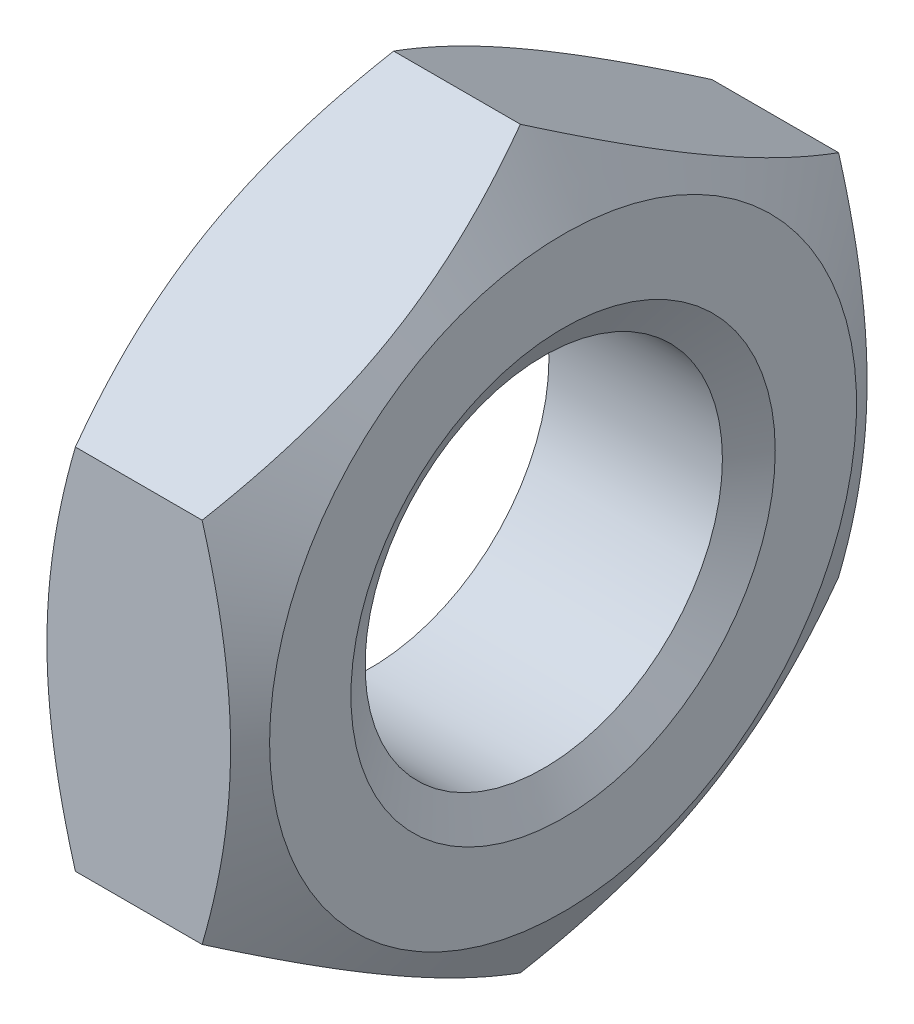
ISO-10303-21;
HEADER;
FILE_DESCRIPTION(('STEP AP214'),'2;1');
FILE_NAME('part.step','',(''),(''),'','','');
FILE_SCHEMA(('AUTOMOTIVE_DESIGN { 1 0 10303 214 1 1 1 1 }'));
ENDSEC;
DATA;
#1=APPLICATION_CONTEXT('core data for automotive mechanical design processes');
#2=APPLICATION_PROTOCOL_DEFINITION('international standard','automotive_design',2000,#1);
#3=PRODUCT_CONTEXT('',#1,'mechanical');
#4=PRODUCT('Part','Part','',(#3));
#5=PRODUCT_RELATED_PRODUCT_CATEGORY('part','',(#4));
#6=PRODUCT_DEFINITION_FORMATION('','',#4);
#7=PRODUCT_DEFINITION_CONTEXT('part definition',#1,'design');
#8=PRODUCT_DEFINITION('design','',#6,#7);
#9=PRODUCT_DEFINITION_SHAPE('','',#8);
#10=(LENGTH_UNIT() NAMED_UNIT(*) SI_UNIT(.MILLI.,.METRE.));
#11=(NAMED_UNIT(*) PLANE_ANGLE_UNIT() SI_UNIT($,.RADIAN.));
#12=(NAMED_UNIT(*) SI_UNIT($,.STERADIAN.) SOLID_ANGLE_UNIT());
#13=UNCERTAINTY_MEASURE_WITH_UNIT(LENGTH_MEASURE(1.E-05),#10,'distance_accuracy_value','');
#14=(GEOMETRIC_REPRESENTATION_CONTEXT(3) GLOBAL_UNCERTAINTY_ASSIGNED_CONTEXT((#13)) GLOBAL_UNIT_ASSIGNED_CONTEXT((#10,
#11,#12)) REPRESENTATION_CONTEXT('',''));
#15=CARTESIAN_POINT('',(0.,0.,0.));
#16=DIRECTION('',(0.,0.,1.));
#17=DIRECTION('',(1.,0.,0.));
#18=AXIS2_PLACEMENT_3D('',#15,#16,#17);
#19=CARTESIAN_POINT('',(0.,-5.19615242270663,9.));
#20=DIRECTION('',(0.,0.,1.));
#21=DIRECTION('',(1.,0.,0.));
#22=AXIS2_PLACEMENT_3D('',#19,#20,#21);
#23=PLANE('',#22);
#24=CARTESIAN_POINT('',(4.79200720064073,5.19615244908284,8.99999996280755));
#25=CARTESIAN_POINT('',(4.85793670212048,4.96774649350098,8.9999999866398));
#26=CARTESIAN_POINT('',(4.92087447602543,4.7384496770077,8.99999999641917));
#27=CARTESIAN_POINT('',(5.03994111979662,4.27799396747797,9.00000000358236));
#28=CARTESIAN_POINT('',(5.09606705063528,4.04683431625193,9.00000000096087));
#29=CARTESIAN_POINT('',(5.2007491843032,3.58222407504139,8.99999999903686));
#30=CARTESIAN_POINT('',(5.24928729971377,3.34876937968299,8.99999999974216));
#31=CARTESIAN_POINT('',(5.33774334411902,2.88027225541252,9.00000000025777));
#32=CARTESIAN_POINT('',(5.37766303413322,2.6452301609984,9.00000000006827));
#33=CARTESIAN_POINT('',(5.4471978692115,2.17951731166322,8.9999999999334));
#34=CARTESIAN_POINT('',(5.47704199201147,1.94888095311327,8.99999999998215));
#35=CARTESIAN_POINT('',(5.52708011623131,1.48657638278532,9.00000000001784));
#36=CARTESIAN_POINT('',(5.54727497025921,1.25490826399993,9.00000000000477));
#37=CARTESIAN_POINT('',(5.57751012460478,0.791170290792554,8.99999999999523));
#38=CARTESIAN_POINT('',(5.58756194770082,0.559101192927455,8.99999999999872));
#39=CARTESIAN_POINT('',(5.59729356888123,0.0947495491293768,9.00000000000127));
#40=CARTESIAN_POINT('',(5.59697368750732,-0.137532989985252,9.00000000000031));
#41=CARTESIAN_POINT('',(5.58668467945731,-0.571777162862451,8.99999999999972));
#42=CARTESIAN_POINT('',(5.57797064829295,-0.773769446121168,8.99999999999992));
#43=CARTESIAN_POINT('',(5.55286890819917,-1.17728085842589,9.00000000000007));
#44=CARTESIAN_POINT('',(5.53648068213988,-1.37879995466608,9.00000000000002));
#45=CARTESIAN_POINT('',(5.47619206434366,-1.98257705214849,8.99999999999994));
#46=CARTESIAN_POINT('',(5.42117526266799,-2.38376637535587,8.99999999999998));
#47=CARTESIAN_POINT('',(5.28363515136557,-3.19040010074397,9.00000000000001));
#48=CARTESIAN_POINT('',(5.20052893315183,-3.5957415794054,9.00000000000001));
#49=CARTESIAN_POINT('',(5.0119132505929,-4.40038055523603,8.99999999999999));
#50=CARTESIAN_POINT('',(4.90644807445685,-4.79968835292957,8.99999999999998));
#51=CARTESIAN_POINT('',(4.79200725771963,-5.19615233570631,9.));
#52=B_SPLINE_CURVE_WITH_KNOTS('',3,(#24,#25,#26,#27,#28,#29,#30,#31,#32,#33,#34,#35,#36,#37,#38,
#39,#40,#41,#42,#43,#44,#45,#46,#47,#48,#49,#50,#51),.UNSPECIFIED.,.F.,.F.,(4,2,2,2,2,2,2,2,2,2,
2,2,2,4),(0.,0.713211353556725,1.42672934244264,2.14192306043958,2.85697050292028,
3.55445831583902,4.25188448742953,4.94851746757656,5.64512891802083,6.25151818008027,
6.85794830989732,8.07167213792062,9.31231054455676,10.5505141021013),.UNSPECIFIED.);
#53=CARTESIAN_POINT('',(4.7920072451693,5.19615244446898,8.9999999623065));
#54=VERTEX_POINT('',#53);
#55=CARTESIAN_POINT('',(4.79200724516929,-5.19615237918194,9.));
#56=VERTEX_POINT('',#55);
#57=EDGE_CURVE('E92',#54,#56,#52,.T.);
#58=ORIENTED_EDGE('',*,*,#57,.F.);
#59=DIRECTION('',(1.,0.,0.));
#60=VECTOR('',#59,1.);
#61=CARTESIAN_POINT('',(0.,5.19615242270663,8.99999999999999));
#62=LINE('',#61,#60);
#63=CARTESIAN_POINT('',(1.2079927548307,5.19615237918194,8.99999999999999));
#64=VERTEX_POINT('',#63);
#65=EDGE_CURVE('E80',#64,#54,#62,.T.);
#66=ORIENTED_EDGE('',*,*,#65,.F.);
#67=CARTESIAN_POINT('',(1.20799274207979,-5.19615233571105,9.00000000030846));
#68=CARTESIAN_POINT('',(1.14206325693808,-4.96774637828837,9.0000000001108));
#69=CARTESIAN_POINT('',(1.07912549077972,-4.73844956232251,9.00000000002969));
#70=CARTESIAN_POINT('',(0.960058854881129,-4.2779938558541,8.99999999997029));
#71=CARTESIAN_POINT('',(0.90393292416847,-4.04683420716203,8.99999999999203));
#72=CARTESIAN_POINT('',(0.799250792738206,-3.58222397040238,9.00000000000798));
#73=CARTESIAN_POINT('',(0.750712679447752,-3.34876927695885,9.00000000000214));
#74=CARTESIAN_POINT('',(0.662256638698184,-2.88027215676435,8.99999999999786));
#75=CARTESIAN_POINT('',(0.622336950218166,-2.64523006451157,8.99999999999943));
#76=CARTESIAN_POINT('',(0.552802118192763,-2.1795172191884,9.00000000000055));
#77=CARTESIAN_POINT('',(0.522957996920903,-1.94888086248689,9.00000000000014));
#78=CARTESIAN_POINT('',(0.472919875623132,-1.48657629590396,8.99999999999985));
#79=CARTESIAN_POINT('',(0.45272502299022,-1.25490817901504,8.99999999999996));
#80=CARTESIAN_POINT('',(0.42248987131652,-0.791170209704866,9.00000000000004));
#81=CARTESIAN_POINT('',(0.412438049495434,-0.559101113840569,9.00000000000001));
#82=CARTESIAN_POINT('',(0.402706430692704,-0.094749474111078,8.99999999999999));
#83=CARTESIAN_POINT('',(0.403026313168857,0.137533062935756,8.99999999999999));
#84=CARTESIAN_POINT('',(0.41331532307057,0.571777230881824,9.));
#85=CARTESIAN_POINT('',(0.422029354968696,0.77376951128332,9.));
#86=CARTESIAN_POINT('',(0.447131096290838,1.17728091785728,9.));
#87=CARTESIAN_POINT('',(0.463519322844663,1.37880001122392,9.));
#88=CARTESIAN_POINT('',(0.523807941769656,1.98257710012436,9.));
#89=CARTESIAN_POINT('',(0.578824743722305,2.38376641762015,9.));
#90=CARTESIAN_POINT('',(0.716364854652096,3.19040013112921,9.));
#91=CARTESIAN_POINT('',(0.799471072168503,3.5957416036305,9.));
#92=CARTESIAN_POINT('',(0.988086752580254,4.40038056724764,9.));
#93=CARTESIAN_POINT('',(1.09355192726476,4.79968835888825,9.));
#94=CARTESIAN_POINT('',(1.20799274228037,5.19615233570631,9.));
#95=B_SPLINE_CURVE_WITH_KNOTS('',3,(#67,#68,#69,#70,#71,#72,#73,#74,#75,#76,#77,#78,#79,#80,#81,
#82,#83,#84,#85,#86,#87,#88,#89,#90,#91,#92,#93,#94),.UNSPECIFIED.,.F.,.F.,(4,2,2,2,2,2,2,2,2,2,
2,2,2,4),(0.,0.713211345889914,1.42672932744395,2.14192303843818,2.8569704737925,
3.55445828061228,4.251884446179,4.94851742016712,5.64512886441926,6.251518118017,
6.85794823936803,8.07167205058462,9.31231043873204,10.5505139776507),.UNSPECIFIED.);
#96=CARTESIAN_POINT('',(1.20799277213881,-5.19615241449046,9.00000001423084));
#97=VERTEX_POINT('',#96);
#98=EDGE_CURVE('E240',#97,#64,#95,.T.);
#99=ORIENTED_EDGE('',*,*,#98,.F.);
#100=DIRECTION('',(1.,0.,0.));
#101=VECTOR('',#100,1.);
#102=CARTESIAN_POINT('',(0.,-5.19615242270663,9.));
#103=LINE('',#102,#101);
#104=EDGE_CURVE('E95',#56,#97,#103,.F.);
#105=ORIENTED_EDGE('',*,*,#104,.F.);
#106=EDGE_LOOP('',(#58,#66,#99,#105));
#107=FACE_BOUND('',#106,.T.);
#108=ADVANCED_FACE('F17',(#107),#23,.T.);
#109=CARTESIAN_POINT('',(0.,5.19615242270663,9.));
#110=DIRECTION('',(0.,0.866025403784438,0.500000000000001));
#111=DIRECTION('',(0.,-0.500000000000001,0.866025403784438));
#112=AXIS2_PLACEMENT_3D('',#109,#110,#111);
#113=PLANE('',#112);
#114=CARTESIAN_POINT('',(4.79200725792021,10.3923048021826,7.54946271439996E-08));
#115=CARTESIAN_POINT('',(4.85793674306191,10.2781018233001,0.197805436899547));
#116=CARTESIAN_POINT('',(4.92087450922028,10.1634534152469,0.396382304492313));
#117=CARTESIAN_POINT('',(5.03994114511887,9.93322556196127,0.79514864358176));
#118=CARTESIAN_POINT('',(5.09606707583153,9.81764573763406,0.995338771689849));
#119=CARTESIAN_POINT('',(5.20074920726179,9.58534061926805,1.39770303958999));
#120=CARTESIAN_POINT('',(5.24928732055224,9.46861327254122,1.59988073474187));
#121=CARTESIAN_POINT('',(5.33774336130181,9.23436471244027,2.00561114242802));
#122=CARTESIAN_POINT('',(5.37766304978183,9.11684366631524,2.20916356527836));
#123=CARTESIAN_POINT('',(5.44719788180723,8.88398724365462,2.61248272019752));
#124=CARTESIAN_POINT('',(5.47704200307909,8.76866906530352,2.81221966413711));
#125=CARTESIAN_POINT('',(5.52708012437687,8.53751678201179,3.21258716308334));
#126=CARTESIAN_POINT('',(5.54727497700978,8.42168272356743,3.4132176375561));
#127=CARTESIAN_POINT('',(5.57751012868348,8.18981373891241,3.81482649967816));
#128=CARTESIAN_POINT('',(5.58756195050456,8.07377919098024,4.01580423212991));
#129=CARTESIAN_POINT('',(5.59729356930729,7.84160337111547,4.4179445484246));
#130=CARTESIAN_POINT('',(5.59697368683114,7.72546210259206,4.61910712636266));
#131=CARTESIAN_POINT('',(5.58668467692943,7.50834001861903,4.99517360724919));
#132=CARTESIAN_POINT('',(5.5779706450313,7.40734387841828,5.17010405344524));
#133=CARTESIAN_POINT('',(5.55286890370916,7.2055881751313,5.51955518225507));
#134=CARTESIAN_POINT('',(5.53648067715533,7.10482862844798,5.6940758364582));
#135=CARTESIAN_POINT('',(5.47619205823034,6.80294008399776,6.21696213366899));
#136=CARTESIAN_POINT('',(5.42117525627769,6.60234542524987,6.56440227434728));
#137=CARTESIAN_POINT('',(5.2836351453479,6.19902856849534,7.2629675617951));
#138=CARTESIAN_POINT('',(5.2005289278315,5.9963578322447,7.61400357418861));
#139=CARTESIAN_POINT('',(5.01191324741975,5.59403835043613,8.31084135755583));
#140=CARTESIAN_POINT('',(4.90644807273524,5.39438445461582,8.65665204904566));
#141=CARTESIAN_POINT('',(4.79200725771963,5.1961524662068,8.9999999246555));
#142=B_SPLINE_CURVE_WITH_KNOTS('',3,(#114,#115,#116,#117,#118,#119,#120,#121,#122,#123,#124,
#125,#126,#127,#128,#129,#130,#131,#132,#133,#134,#135,#136,#137,#138,#139,#140,#141),
.UNSPECIFIED.,.F.,.F.,(4,2,2,2,2,2,2,2,2,2,2,2,2,4),(0.,0.713211345889915,1.42672932744395,
2.14192303843818,2.85697047379251,3.55445828061228,4.25188444617901,4.94851742016713,
5.64512886441927,6.251518118017,6.85794823936804,8.07167205058462,9.31231043873203,
10.5505139776507),.UNSPECIFIED.);
#143=CARTESIAN_POINT('',(4.79200722786119,10.3923048536294,1.42308397558634E-08));
#144=VERTEX_POINT('',#143);
#145=EDGE_CURVE('E21',#144,#54,#142,.T.);
#146=ORIENTED_EDGE('',*,*,#145,.F.);
#147=DIRECTION('',(1.,0.,0.));
#148=VECTOR('',#147,1.);
#149=CARTESIAN_POINT('',(0.,10.3923048454133,0.));
#150=LINE('',#149,#148);
#151=CARTESIAN_POINT('',(1.20799275483071,10.3923048236509,3.76934946210269E-08));
#152=VERTEX_POINT('',#151);
#153=EDGE_CURVE('E73',#152,#144,#150,.T.);
#154=ORIENTED_EDGE('',*,*,#153,.F.);
#155=CARTESIAN_POINT('',(1.20799279935926,5.19615237730893,9.00000000424624));
#156=CARTESIAN_POINT('',(1.14206329787952,5.31035537573919,8.80219465625281));
#157=CARTESIAN_POINT('',(1.07912552397457,5.42500379245501,8.60361779305241));
#158=CARTESIAN_POINT('',(0.960058880203377,5.65523165342339,8.20485145486368));
#159=CARTESIAN_POINT('',(0.903932949364721,5.77081147676613,8.00466132326123));
#160=CARTESIAN_POINT('',(0.799250815696801,6.00311659570516,7.60229705055248));
#161=CARTESIAN_POINT('',(0.750712700286224,6.11984394399517,7.400119354092));
#162=CARTESIAN_POINT('',(0.662256655880975,6.35409250657693,6.99438894313163));
#163=CARTESIAN_POINT('',(0.622336965866783,6.47161355361988,6.79083651831554));
#164=CARTESIAN_POINT('',(0.552802130788498,6.70446997817067,6.38751735985501));
#165=CARTESIAN_POINT('',(0.522958007988527,6.81978815748786,6.1877804143388));
#166=CARTESIAN_POINT('',(0.472919883768696,7.05094044268274,5.78741291216698));
#167=CARTESIAN_POINT('',(0.452725029740792,7.16677450206412,5.58678243604535));
#168=CARTESIAN_POINT('',(0.422489875395221,7.39864348865954,5.18517357054348));
#169=CARTESIAN_POINT('',(0.412438052299181,7.51467803759512,4.98419583636072));
#170=CARTESIAN_POINT('',(0.402706431118769,7.74685385949637,4.5820555165438));
#171=CARTESIAN_POINT('',(0.403026312492687,7.86299512905285,4.3808929368145));
#172=CARTESIAN_POINT('',(0.41331532054269,8.08011721549093,4.00482645165718));
#173=CARTESIAN_POINT('',(0.422029351707053,8.18111335712047,3.82989600298681));
#174=CARTESIAN_POINT('',(0.447131091800832,8.38286906327296,3.48044486921406));
#175=CARTESIAN_POINT('',(0.463519317860121,8.48362861139301,3.30592421252236));
#176=CARTESIAN_POINT('',(0.523807935656345,8.78551716013415,2.78303790787932));
#177=CARTESIAN_POINT('',(0.578824737332017,8.98611182173787,2.43559776225466));
#178=CARTESIAN_POINT('',(0.716364848634437,9.38942868443195,1.7370324645193));
#179=CARTESIAN_POINT('',(0.799471066848173,9.59209942376266,1.38599644679096));
#180=CARTESIAN_POINT('',(0.9880867494071,9.99441891167796,0.689158652846528));
#181=CARTESIAN_POINT('',(1.09355192554315,10.1940728105247,0.343347956114703));
#182=CARTESIAN_POINT('',(1.20799274228037,10.3923048019131,7.53445016284375E-08));
#183=B_SPLINE_CURVE_WITH_KNOTS('',3,(#155,#156,#157,#158,#159,#160,#161,#162,#163,#164,#165,
#166,#167,#168,#169,#170,#171,#172,#173,#174,#175,#176,#177,#178,#179,#180,#181,#182),
.UNSPECIFIED.,.F.,.F.,(4,2,2,2,2,2,2,2,2,2,2,2,2,4),(0.,0.713211353556726,1.42672934244264,
2.14192306043958,2.85697050292028,3.55445831583901,4.25188448742953,4.94851746757656,
5.64512891802083,6.25151818008027,6.85794830989731,8.07167213792061,9.31231054455675,
10.5505141021013),.UNSPECIFIED.);
#184=EDGE_CURVE('E83',#64,#152,#183,.T.);
#185=ORIENTED_EDGE('',*,*,#184,.F.);
#186=ORIENTED_EDGE('',*,*,#65,.T.);
#187=EDGE_LOOP('',(#146,#154,#185,#186));
#188=FACE_BOUND('',#187,.T.);
#189=ADVANCED_FACE('F82',(#188),#113,.T.);
#190=CARTESIAN_POINT('',(0.,10.3923048454133,0.));
#191=DIRECTION('',(0.,0.866025403784439,-0.499999999999999));
#192=DIRECTION('',(0.,0.499999999999999,0.866025403784439));
#193=AXIS2_PLACEMENT_3D('',#190,#191,#192);
#194=PLANE('',#193);
#195=CARTESIAN_POINT('',(4.79200720064073,5.19615237730895,-9.00000000424623));
#196=CARTESIAN_POINT('',(4.8579367021258,5.31035537574843,-8.80219465623683));
#197=CARTESIAN_POINT('',(4.92087447603559,5.42500379247355,-8.60361779302033));
#198=CARTESIAN_POINT('',(5.03994111981531,5.65523165346068,-8.20485145479911));
#199=CARTESIAN_POINT('',(5.09606705065764,5.77081147681288,-8.00466132318027));
#200=CARTESIAN_POINT('',(5.20074918433207,6.00311659577217,-7.60229705043644));
#201=CARTESIAN_POINT('',(5.2492872997454,6.11984394407298,-7.40011935395725));
#202=CARTESIAN_POINT('',(5.33774334415436,6.35409250667648,-6.99438894295923));
#203=CARTESIAN_POINT('',(5.37766303416951,6.47161355373035,-6.79083651812422));
#204=CARTESIAN_POINT('',(5.44719786924171,6.70446997828266,-6.38751735966105));
#205=CARTESIAN_POINT('',(5.47704199203626,6.81978815759033,-6.18778041416133));
#206=CARTESIAN_POINT('',(5.52708011624672,7.05094044276603,-5.78741291202273));
#207=CARTESIAN_POINT('',(5.54727497027068,7.16677450213776,-5.58678243591783));
#208=CARTESIAN_POINT('',(5.57751012460983,7.39864348871271,-5.18517357045141));
#209=CARTESIAN_POINT('',(5.58756194770349,7.51467803763747,-4.98419583628739));
#210=CARTESIAN_POINT('',(5.59729356888121,7.74685385951727,-4.5820555165076));
#211=CARTESIAN_POINT('',(5.59697368750695,7.86299512906313,-4.3808929367967));
#212=CARTESIAN_POINT('',(5.58668467934319,8.08011721789683,-4.00482644749007));
#213=CARTESIAN_POINT('',(5.57797064787759,8.18111336193021,-3.8298959946561));
#214=CARTESIAN_POINT('',(5.55286890682113,8.38286907287596,-3.48044485258118));
#215=CARTESIAN_POINT('',(5.53648068010034,8.48362862338542,-3.3059241917509));
#216=CARTESIAN_POINT('',(5.47619205981188,8.78551717927527,-2.78303787472593));
#217=CARTESIAN_POINT('',(5.42117525579857,8.98611184560422,-2.43559772091693));
#218=CARTESIAN_POINT('',(5.28363513866581,9.38942871785636,-1.73703240662651));
#219=CARTESIAN_POINT('',(5.2005289169171,9.59209946201516,-1.38599638053566));
#220=CARTESIAN_POINT('',(5.01191322651947,9.99441895941098,-0.689158570170496));
#221=CARTESIAN_POINT('',(4.90644804608437,10.1940728629108,-0.343347865379344));
#222=CARTESIAN_POINT('',(4.79200722482521,10.3923048588879,2.33387573085237E-08));
#223=B_SPLINE_CURVE_WITH_KNOTS('',3,(#195,#196,#197,#198,#199,#200,#201,#202,#203,#204,#205,
#206,#207,#208,#209,#210,#211,#212,#213,#214,#215,#216,#217,#218,#219,#220,#221,#222),
.UNSPECIFIED.,.F.,.F.,(4,2,2,2,2,2,2,2,2,2,2,2,2,4),(0.,0.713211353614336,1.42672934255798,
2.14192306062003,2.85697050316579,3.55445831602579,4.25188448755768,4.94851746763938,
5.64512891802085,6.25151819451751,6.85794833877609,8.07167219576964,9.31231063288044,
10.5505142206676),.UNSPECIFIED.);
#224=CARTESIAN_POINT('',(4.79200724516929,5.19615237918196,-9.));
#225=VERTEX_POINT('',#224);
#226=EDGE_CURVE('E94',#225,#144,#223,.T.);
#227=ORIENTED_EDGE('',*,*,#226,.F.);
#228=DIRECTION('',(-1.,0.,0.));
#229=VECTOR('',#228,1.);
#230=CARTESIAN_POINT('',(0.,5.19615242270666,-9.));
#231=LINE('',#230,#229);
#232=CARTESIAN_POINT('',(1.20799275483071,5.196152444469,-8.9999999623065));
#233=VERTEX_POINT('',#232);
#234=EDGE_CURVE('E224',#233,#225,#231,.F.);
#235=ORIENTED_EDGE('',*,*,#234,.F.);
#236=CARTESIAN_POINT('',(1.20799279935927,10.3923048263918,4.14386846990018E-08));
#237=CARTESIAN_POINT('',(1.14206329787952,10.2781018692402,-0.197805330386988));
#238=CARTESIAN_POINT('',(1.07912552397457,10.1634534694627,-0.396382203366748));
#239=CARTESIAN_POINT('',(0.960058880203378,9.93322562090135,-0.795148548718683));
#240=CARTESIAN_POINT('',(0.903932949364723,9.81764579301805,-0.995338677699643));
#241=CARTESIAN_POINT('',(0.799250815696804,9.58534067074654,-1.39770294848439));
#242=CARTESIAN_POINT('',(0.750712700286226,9.46861332367815,-1.59988064565016));
#243=CARTESIAN_POINT('',(0.662256655880977,9.23436476198945,-2.00561105712615));
#244=CARTESIAN_POINT('',(0.622336965866786,9.11684371461827,-2.20916348175273));
#245=CARTESIAN_POINT('',(0.552802130788501,8.88398728983388,-2.61248264007839));
#246=CARTESIAN_POINT('',(0.522958007988529,8.76866911060113,-2.81221958564336));
#247=CARTESIAN_POINT('',(0.472919883768698,8.53751682546806,-3.21258708785086));
#248=CARTESIAN_POINT('',(0.452725029740794,8.42168276606405,-3.41321756395942));
#249=CARTESIAN_POINT('',(0.422489875395223,8.18981377945209,-3.81482642945174));
#250=CARTESIAN_POINT('',(0.412438052299182,8.07377923052258,-4.01580416363801));
#251=CARTESIAN_POINT('',(0.402706431118771,7.84160340862574,-4.41794448345748));
#252=CARTESIAN_POINT('',(0.403026312492689,7.7254621390676,-4.61910706318582));
#253=CARTESIAN_POINT('',(0.413315320542692,7.50834005262849,-4.99517354834254));
#254=CARTESIAN_POINT('',(0.422029351707055,7.4073439109993,-5.17010399701311));
#255=CARTESIAN_POINT('',(0.447131091800834,7.20558820484707,-5.51955513078601));
#256=CARTESIAN_POINT('',(0.463519317860123,7.10482865672694,-5.69407578747767));
#257=CARTESIAN_POINT('',(0.523807935656347,6.80294010798567,-6.21696209212063));
#258=CARTESIAN_POINT('',(0.578824737332018,6.60234544638201,-6.56440223774532));
#259=CARTESIAN_POINT('',(0.716364848634437,6.19902858368799,-7.26296753548071));
#260=CARTESIAN_POINT('',(0.799471066848173,5.99635784435727,-7.61400355320905));
#261=CARTESIAN_POINT('',(0.9880867494071,5.59403835644194,-8.31084134715346));
#262=CARTESIAN_POINT('',(1.09355192554315,5.39438445759517,-8.65665204388528));
#263=CARTESIAN_POINT('',(1.20799274228037,5.19615246620682,-8.99999992465549));
#264=B_SPLINE_CURVE_WITH_KNOTS('',3,(#236,#237,#238,#239,#240,#241,#242,#243,#244,#245,#246,
#247,#248,#249,#250,#251,#252,#253,#254,#255,#256,#257,#258,#259,#260,#261,#262,#263),
.UNSPECIFIED.,.F.,.F.,(4,2,2,2,2,2,2,2,2,2,2,2,2,4),(0.,0.713211353556727,1.42672934244264,
2.14192306043958,2.85697050292028,3.55445831583902,4.25188448742953,4.94851746757656,
5.64512891802083,6.25151818008027,6.85794830989731,8.07167213792061,9.31231054455674,
10.5505141021013),.UNSPECIFIED.);
#265=EDGE_CURVE('E162',#152,#233,#264,.T.);
#266=ORIENTED_EDGE('',*,*,#265,.F.);
#267=ORIENTED_EDGE('',*,*,#153,.T.);
#268=EDGE_LOOP('',(#227,#235,#266,#267));
#269=FACE_BOUND('',#268,.T.);
#270=ADVANCED_FACE('F170',(#269),#194,.T.);
#271=CARTESIAN_POINT('',(0.,5.19615242270665,-9.));
#272=DIRECTION('',(0.,0.,-1.));
#273=DIRECTION('',(-1.,0.,0.));
#274=AXIS2_PLACEMENT_3D('',#271,#272,#273);
#275=PLANE('',#274);
#276=CARTESIAN_POINT('',(4.79200720064075,-5.1961524490828,-8.99999996280757));
#277=CARTESIAN_POINT('',(4.85793670212049,-4.96774649350094,-8.99999998663981));
#278=CARTESIAN_POINT('',(4.92087447602544,-4.73844967700766,-8.99999999641917));
#279=CARTESIAN_POINT('',(5.03994111979663,-4.27799396747794,-9.00000000358237));
#280=CARTESIAN_POINT('',(5.09606705063528,-4.04683431625189,-9.00000000096087));
#281=CARTESIAN_POINT('',(5.2007491843032,-3.58222407504135,-8.99999999903687));
#282=CARTESIAN_POINT('',(5.24928729971378,-3.34876937968296,-8.99999999974217));
#283=CARTESIAN_POINT('',(5.33774334411903,-2.88027225541249,-9.00000000025778));
#284=CARTESIAN_POINT('',(5.37766303413322,-2.64523016099837,-9.00000000006827));
#285=CARTESIAN_POINT('',(5.4471978692115,-2.17951731166319,-8.9999999999334));
#286=CARTESIAN_POINT('',(5.47704199201147,-1.94888095311324,-8.99999999998216));
#287=CARTESIAN_POINT('',(5.52708011623131,-1.48657638278528,-9.00000000001784));
#288=CARTESIAN_POINT('',(5.54727497025921,-1.2549082639999,-9.00000000000478));
#289=CARTESIAN_POINT('',(5.57751012460478,-0.791170290792525,-8.99999999999523));
#290=CARTESIAN_POINT('',(5.58756194770082,-0.559101192927427,-8.99999999999873));
#291=CARTESIAN_POINT('',(5.59729356888123,-0.0947495491293491,-9.00000000000127));
#292=CARTESIAN_POINT('',(5.59697368750731,0.137532989985279,-9.00000000000032));
#293=CARTESIAN_POINT('',(5.58668467945731,0.571777162862476,-8.99999999999972));
#294=CARTESIAN_POINT('',(5.57797064829295,0.773769446121193,-8.99999999999993));
#295=CARTESIAN_POINT('',(5.55286890819917,1.17728085842592,-9.00000000000008));
#296=CARTESIAN_POINT('',(5.53648068213988,1.3787999546661,-9.00000000000003));
#297=CARTESIAN_POINT('',(5.47619206434365,1.98257705214851,-8.99999999999995));
#298=CARTESIAN_POINT('',(5.42117526266798,2.38376637535589,-8.99999999999999));
#299=CARTESIAN_POINT('',(5.28363515136556,3.19040010074399,-9.00000000000002));
#300=CARTESIAN_POINT('',(5.20052893315183,3.59574157940541,-9.00000000000001));
#301=CARTESIAN_POINT('',(5.0119132505929,4.40038055523604,-8.99999999999999));
#302=CARTESIAN_POINT('',(4.90644807445685,4.79968835292958,-8.99999999999999));
#303=CARTESIAN_POINT('',(4.79200725771963,5.19615233570631,-9.));
#304=B_SPLINE_CURVE_WITH_KNOTS('',3,(#276,#277,#278,#279,#280,#281,#282,#283,#284,#285,#286,
#287,#288,#289,#290,#291,#292,#293,#294,#295,#296,#297,#298,#299,#300,#301,#302,#303),
.UNSPECIFIED.,.F.,.F.,(4,2,2,2,2,2,2,2,2,2,2,2,2,4),(0.,0.713211353556724,1.42672934244264,
2.14192306043957,2.85697050292027,3.55445831583901,4.25188448742952,4.94851746757655,
5.64512891802082,6.25151818008025,6.8579483098973,8.0716721379206,9.31231054455673,
10.5505141021013),.UNSPECIFIED.);
#305=CARTESIAN_POINT('',(4.79200724516929,-5.19615244446895,-8.99999996230654));
#306=VERTEX_POINT('',#305);
#307=EDGE_CURVE('E130',#306,#225,#304,.T.);
#308=ORIENTED_EDGE('',*,*,#307,.F.);
#309=DIRECTION('',(1.,0.,0.));
#310=VECTOR('',#309,1.);
#311=CARTESIAN_POINT('',(0.,-5.1961524227066,-9.00000000000003));
#312=LINE('',#311,#310);
#313=CARTESIAN_POINT('',(1.2079927548307,-5.1961523791819,-9.00000000000002));
#314=VERTEX_POINT('',#313);
#315=EDGE_CURVE('E226',#314,#306,#312,.T.);
#316=ORIENTED_EDGE('',*,*,#315,.F.);
#317=CARTESIAN_POINT('',(1.20799279935928,5.19615244908286,-8.99999996280756));
#318=CARTESIAN_POINT('',(1.14206329787953,4.967746493501,-8.99999998663981));
#319=CARTESIAN_POINT('',(1.07912552397458,4.73844967700772,-8.99999999641917));
#320=CARTESIAN_POINT('',(0.960058880203384,4.27799396747799,-9.00000000358237));
#321=CARTESIAN_POINT('',(0.903932949364728,4.04683431625194,-9.00000000096087));
#322=CARTESIAN_POINT('',(0.799250815696808,3.5822240750414,-8.99999999903687));
#323=CARTESIAN_POINT('',(0.75071270028623,3.34876937968301,-8.99999999974217));
#324=CARTESIAN_POINT('',(0.66225665588098,2.88027225541254,-9.00000000025778));
#325=CARTESIAN_POINT('',(0.622336965866788,2.64523016099841,-9.00000000006827));
#326=CARTESIAN_POINT('',(0.552802130788502,2.17951731166323,-8.9999999999334));
#327=CARTESIAN_POINT('',(0.522958007988531,1.94888095311329,-8.99999999998216));
#328=CARTESIAN_POINT('',(0.472919883768699,1.48657638278533,-9.00000000001784));
#329=CARTESIAN_POINT('',(0.452725029740795,1.25490826399995,-9.00000000000478));
#330=CARTESIAN_POINT('',(0.422489875395222,0.791170290792568,-8.99999999999523));
#331=CARTESIAN_POINT('',(0.412438052299181,0.559101192927469,-8.99999999999873));
#332=CARTESIAN_POINT('',(0.402706431118769,0.0947495491293892,-9.00000000000127));
#333=CARTESIAN_POINT('',(0.403026312492686,-0.13753298998524,-9.00000000000032));
#334=CARTESIAN_POINT('',(0.413315320542689,-0.571777162862439,-8.99999999999972));
#335=CARTESIAN_POINT('',(0.422029351707052,-0.773769446121155,-8.99999999999993));
#336=CARTESIAN_POINT('',(0.44713109180083,-1.17728085842588,-9.00000000000008));
#337=CARTESIAN_POINT('',(0.463519317860118,-1.37879995466606,-9.00000000000003));
#338=CARTESIAN_POINT('',(0.52380793565634,-1.98257705214847,-8.99999999999995));
#339=CARTESIAN_POINT('',(0.578824737332011,-2.38376637535585,-8.99999999999999));
#340=CARTESIAN_POINT('',(0.716364848634429,-3.19040010074394,-9.00000000000002));
#341=CARTESIAN_POINT('',(0.799471066848164,-3.59574157940537,-9.00000000000001));
#342=CARTESIAN_POINT('',(0.988086749407089,-4.400380555236,-8.99999999999999));
#343=CARTESIAN_POINT('',(1.09355192554314,-4.79968835292953,-8.99999999999999));
#344=CARTESIAN_POINT('',(1.20799274228036,-5.19615233570627,-9.));
#345=B_SPLINE_CURVE_WITH_KNOTS('',3,(#317,#318,#319,#320,#321,#322,#323,#324,#325,#326,#327,
#328,#329,#330,#331,#332,#333,#334,#335,#336,#337,#338,#339,#340,#341,#342,#343,#344),
.UNSPECIFIED.,.F.,.F.,(4,2,2,2,2,2,2,2,2,2,2,2,2,4),(0.,0.713211353556728,1.42672934244265,
2.14192306043958,2.85697050292028,3.55445831583902,4.25188448742954,4.94851746757657,
5.64512891802084,6.25151818008028,6.85794830989732,8.07167213792061,9.31231054455675,
10.5505141021013),.UNSPECIFIED.);
#346=EDGE_CURVE('E153',#233,#314,#345,.T.);
#347=ORIENTED_EDGE('',*,*,#346,.F.);
#348=ORIENTED_EDGE('',*,*,#234,.T.);
#349=EDGE_LOOP('',(#308,#316,#347,#348));
#350=FACE_BOUND('',#349,.T.);
#351=ADVANCED_FACE('F142',(#350),#275,.T.);
#352=CARTESIAN_POINT('',(0.,-5.19615242270661,-9.00000000000002));
#353=DIRECTION('',(0.,-0.866025403784438,-0.500000000000001));
#354=DIRECTION('',(0.,0.500000000000001,-0.866025403784438));
#355=AXIS2_PLACEMENT_3D('',#352,#353,#354);
#356=PLANE('',#355);
#357=CARTESIAN_POINT('',(4.79200720064073,-10.3923048263918,4.14386833859012E-08));
#358=CARTESIAN_POINT('',(4.85793670212048,-10.2781018692402,-0.19780533038699));
#359=CARTESIAN_POINT('',(4.92087447602543,-10.1634534694627,-0.396382203366749));
#360=CARTESIAN_POINT('',(5.03994111979662,-9.93322562090136,-0.795148548718683));
#361=CARTESIAN_POINT('',(5.09606705063527,-9.81764579301805,-0.995338677699643));
#362=CARTESIAN_POINT('',(5.20074918430319,-9.58534067074654,-1.39770294848439));
#363=CARTESIAN_POINT('',(5.24928729971377,-9.46861332367815,-1.59988064565016));
#364=CARTESIAN_POINT('',(5.33774334411902,-9.23436476198945,-2.00561105712615));
#365=CARTESIAN_POINT('',(5.37766303413321,-9.11684371461827,-2.20916348175273));
#366=CARTESIAN_POINT('',(5.4471978692115,-8.88398728983388,-2.61248264007839));
#367=CARTESIAN_POINT('',(5.47704199201147,-8.76866911060113,-2.81221958564336));
#368=CARTESIAN_POINT('',(5.52708011623131,-8.53751682546805,-3.21258708785086));
#369=CARTESIAN_POINT('',(5.54727497025921,-8.42168276606405,-3.41321756395942));
#370=CARTESIAN_POINT('',(5.57751012460478,-8.18981377945209,-3.81482642945174));
#371=CARTESIAN_POINT('',(5.58756194770082,-8.07377923052257,-4.015804163638));
#372=CARTESIAN_POINT('',(5.59729356888123,-7.84160340862573,-4.41794448345748));
#373=CARTESIAN_POINT('',(5.59697368750732,-7.72546213906759,-4.61910706318582));
#374=CARTESIAN_POINT('',(5.58668467945731,-7.50834005262848,-4.99517354834254));
#375=CARTESIAN_POINT('',(5.57797064829295,-7.40734391099929,-5.17010399701311));
#376=CARTESIAN_POINT('',(5.55286890819917,-7.20558820484706,-5.51955513078602));
#377=CARTESIAN_POINT('',(5.53648068213988,-7.10482865672692,-5.69407578747767));
#378=CARTESIAN_POINT('',(5.47619206434366,-6.80294010798564,-6.21696209212064));
#379=CARTESIAN_POINT('',(5.42117526266799,-6.60234544638199,-6.56440223774534));
#380=CARTESIAN_POINT('',(5.28363515136557,-6.19902858368796,-7.26296753548073));
#381=CARTESIAN_POINT('',(5.20052893315183,-5.99635784435724,-7.61400355320907));
#382=CARTESIAN_POINT('',(5.0119132505929,-5.5940383564419,-8.31084134715349));
#383=CARTESIAN_POINT('',(4.90644807445685,-5.39438445759513,-8.65665204388531));
#384=CARTESIAN_POINT('',(4.79200725771962,-5.19615246620677,-8.99999992465553));
#385=B_SPLINE_CURVE_WITH_KNOTS('',3,(#357,#358,#359,#360,#361,#362,#363,#364,#365,#366,#367,
#368,#369,#370,#371,#372,#373,#374,#375,#376,#377,#378,#379,#380,#381,#382,#383,#384),
.UNSPECIFIED.,.F.,.F.,(4,2,2,2,2,2,2,2,2,2,2,2,2,4),(0.,0.713211353556726,1.42672934244265,
2.14192306043958,2.85697050292028,3.55445831583902,4.25188448742954,4.94851746757657,
5.64512891802084,6.25151818008028,6.85794830989733,8.07167213792064,9.31231054455678,
10.5505141021013),.UNSPECIFIED.);
#386=CARTESIAN_POINT('',(4.7920072451693,-10.3923048236509,3.76934937351667E-08));
#387=VERTEX_POINT('',#386);
#388=EDGE_CURVE('E98',#387,#306,#385,.T.);
#389=ORIENTED_EDGE('',*,*,#388,.F.);
#390=DIRECTION('',(1.,0.,0.));
#391=VECTOR('',#390,1.);
#392=CARTESIAN_POINT('',(0.,-10.3923048454133,0.));
#393=LINE('',#392,#391);
#394=CARTESIAN_POINT('',(1.2079927548307,-10.3923048236509,-3.76934950024652E-08));
#395=VERTEX_POINT('',#394);
#396=EDGE_CURVE('E228',#395,#387,#393,.T.);
#397=ORIENTED_EDGE('',*,*,#396,.F.);
#398=CARTESIAN_POINT('',(1.20799279935928,-5.1961523773089,-9.00000000424627));
#399=CARTESIAN_POINT('',(1.14206329787953,-5.31035537573916,-8.80219465625284));
#400=CARTESIAN_POINT('',(1.07912552397458,-5.42500379245498,-8.60361779305245));
#401=CARTESIAN_POINT('',(0.960058880203383,-5.65523165342336,-8.20485145486371));
#402=CARTESIAN_POINT('',(0.903932949364727,-5.7708114767661,-8.00466132326126));
#403=CARTESIAN_POINT('',(0.799250815696807,-6.00311659570514,-7.60229705055251));
#404=CARTESIAN_POINT('',(0.750712700286229,-6.11984394399514,-7.40011935409203));
#405=CARTESIAN_POINT('',(0.662256655880979,-6.35409250657691,-6.99438894313166));
#406=CARTESIAN_POINT('',(0.622336965866787,-6.47161355361985,-6.79083651831557));
#407=CARTESIAN_POINT('',(0.5528021307885,-6.70446997817064,-6.38751735985504));
#408=CARTESIAN_POINT('',(0.522958007988528,-6.81978815748784,-6.18778041433883));
#409=CARTESIAN_POINT('',(0.472919883768696,-7.05094044268272,-5.78741291216701));
#410=CARTESIAN_POINT('',(0.452725029740791,-7.1667745020641,-5.58678243604538));
#411=CARTESIAN_POINT('',(0.422489875395219,-7.39864348865952,-5.18517357054351));
#412=CARTESIAN_POINT('',(0.412438052299179,-7.5146780375951,-4.98419583636075));
#413=CARTESIAN_POINT('',(0.402706431118766,-7.74685385949634,-4.58205551654382));
#414=CARTESIAN_POINT('',(0.403026312492684,-7.86299512905283,-4.38089293681452));
#415=CARTESIAN_POINT('',(0.413315320542686,-8.08011721549092,-4.00482645165721));
#416=CARTESIAN_POINT('',(0.422029351707048,-8.18111335712045,-3.82989600298684));
#417=CARTESIAN_POINT('',(0.447131091800827,-8.38286906327295,-3.48044486921409));
#418=CARTESIAN_POINT('',(0.463519317860115,-8.48362861139299,-3.30592421252238));
#419=CARTESIAN_POINT('',(0.523807935656339,-8.78551716013413,-2.78303790787933));
#420=CARTESIAN_POINT('',(0.578824737332011,-8.98611182173786,-2.43559776225468));
#421=CARTESIAN_POINT('',(0.71636484863443,-9.38942868443194,-1.73703246451932));
#422=CARTESIAN_POINT('',(0.799471066848166,-9.59209942376264,-1.38599644679097));
#423=CARTESIAN_POINT('',(0.988086749407093,-9.99441891167795,-0.689158652846535));
#424=CARTESIAN_POINT('',(1.09355192554315,-10.1940728105247,-0.343347956114708));
#425=CARTESIAN_POINT('',(1.20799274228037,-10.3923048019131,-7.53445053492153E-08));
#426=B_SPLINE_CURVE_WITH_KNOTS('',3,(#398,#399,#400,#401,#402,#403,#404,#405,#406,#407,#408,
#409,#410,#411,#412,#413,#414,#415,#416,#417,#418,#419,#420,#421,#422,#423,#424,#425),
.UNSPECIFIED.,.F.,.F.,(4,2,2,2,2,2,2,2,2,2,2,2,2,4),(0.,0.713211353556729,1.42672934244265,
2.14192306043958,2.85697050292028,3.55445831583902,4.25188448742954,4.94851746757657,
5.64512891802084,6.25151818008028,6.85794830989733,8.07167213792063,9.31231054455677,
10.5505141021013),.UNSPECIFIED.);
#427=EDGE_CURVE('E40',#314,#395,#426,.T.);
#428=ORIENTED_EDGE('',*,*,#427,.F.);
#429=ORIENTED_EDGE('',*,*,#315,.T.);
#430=EDGE_LOOP('',(#389,#397,#428,#429));
#431=FACE_BOUND('',#430,.T.);
#432=ADVANCED_FACE('F139',(#431),#356,.T.);
#433=CARTESIAN_POINT('',(0.,-10.3923048454133,0.));
#434=DIRECTION('',(0.,-0.866025403784439,0.5));
#435=DIRECTION('',(0.,-0.5,-0.866025403784439));
#436=AXIS2_PLACEMENT_3D('',#433,#434,#435);
#437=PLANE('',#436);
#438=CARTESIAN_POINT('',(4.79200720064073,-5.19615237730893,9.00000000424624));
#439=CARTESIAN_POINT('',(4.85793670212048,-5.31035537573919,8.80219465625281));
#440=CARTESIAN_POINT('',(4.92087447602543,-5.42500379245501,8.60361779305241));
#441=CARTESIAN_POINT('',(5.03994111979662,-5.65523165342339,8.20485145486368));
#442=CARTESIAN_POINT('',(5.09606705063528,-5.77081147676613,8.00466132326123));
#443=CARTESIAN_POINT('',(5.2007491843032,-6.00311659570516,7.60229705055248));
#444=CARTESIAN_POINT('',(5.24928729971377,-6.11984394399517,7.400119354092));
#445=CARTESIAN_POINT('',(5.33774334411902,-6.35409250657694,6.99438894313163));
#446=CARTESIAN_POINT('',(5.37766303413322,-6.47161355361988,6.79083651831554));
#447=CARTESIAN_POINT('',(5.4471978692115,-6.70446997817067,6.38751735985501));
#448=CARTESIAN_POINT('',(5.47704199201147,-6.81978815748786,6.18778041433879));
#449=CARTESIAN_POINT('',(5.52708011623131,-7.05094044268275,5.78741291216698));
#450=CARTESIAN_POINT('',(5.54727497025921,-7.16677450206412,5.58678243604535));
#451=CARTESIAN_POINT('',(5.57751012460478,-7.39864348865954,5.18517357054348));
#452=CARTESIAN_POINT('',(5.58756194770082,-7.51467803759512,4.98419583636072));
#453=CARTESIAN_POINT('',(5.59729356888123,-7.74685385949637,4.58205551654379));
#454=CARTESIAN_POINT('',(5.59697368750732,-7.86299512905285,4.38089293681449));
#455=CARTESIAN_POINT('',(5.58668467945731,-8.08011721549094,4.00482645165718));
#456=CARTESIAN_POINT('',(5.57797064829295,-8.18111335712047,3.82989600298681));
#457=CARTESIAN_POINT('',(5.55286890819917,-8.38286906327296,3.48044486921406));
#458=CARTESIAN_POINT('',(5.53648068213988,-8.48362861139301,3.30592421252235));
#459=CARTESIAN_POINT('',(5.47619206434366,-8.78551716013415,2.78303790787931));
#460=CARTESIAN_POINT('',(5.42117526266798,-8.98611182173787,2.43559776225465));
#461=CARTESIAN_POINT('',(5.28363515136557,-9.38942868443195,1.7370324645193));
#462=CARTESIAN_POINT('',(5.20052893315183,-9.59209942376265,1.38599644679095));
#463=CARTESIAN_POINT('',(5.0119132505929,-9.99441891167796,0.68915865284652));
#464=CARTESIAN_POINT('',(4.90644807445685,-10.1940728105247,0.343347956114696));
#465=CARTESIAN_POINT('',(4.79200725771963,-10.3923048019131,7.53444965085657E-08));
#466=B_SPLINE_CURVE_WITH_KNOTS('',3,(#438,#439,#440,#441,#442,#443,#444,#445,#446,#447,#448,
#449,#450,#451,#452,#453,#454,#455,#456,#457,#458,#459,#460,#461,#462,#463,#464,#465),
.UNSPECIFIED.,.F.,.F.,(4,2,2,2,2,2,2,2,2,2,2,2,2,4),(0.,0.713211353556726,1.42672934244264,
2.14192306043958,2.85697050292028,3.55445831583902,4.25188448742953,4.94851746757656,
5.64512891802083,6.25151818008027,6.85794830989732,8.07167213792061,9.31231054455675,
10.5505141021013),.UNSPECIFIED.);
#467=EDGE_CURVE('E97',#56,#387,#466,.T.);
#468=ORIENTED_EDGE('',*,*,#467,.F.);
#469=ORIENTED_EDGE('',*,*,#104,.T.);
#470=CARTESIAN_POINT('',(1.20799279935927,-10.3923048263918,-4.14386860258273E-08));
#471=CARTESIAN_POINT('',(1.1420632978742,-10.2781018692309,0.197805330402964));
#472=CARTESIAN_POINT('',(1.0791255239644,-10.1634534694442,0.396382203398829));
#473=CARTESIAN_POINT('',(0.960058880184688,-9.93322562086408,0.79514854878325));
#474=CARTESIAN_POINT('',(0.903932949342354,-9.81764579297131,0.995338677780592));
#475=CARTESIAN_POINT('',(0.799250815667925,-9.58534067067955,1.39770294860042));
#476=CARTESIAN_POINT('',(0.750712700254598,-9.46861332360035,1.59988064578491));
#477=CARTESIAN_POINT('',(0.66225665584564,-9.23436476188992,2.00561105729854));
#478=CARTESIAN_POINT('',(0.622336965830488,-9.11684371450781,2.20916348194405));
#479=CARTESIAN_POINT('',(0.552802130758288,-8.8839872897219,2.61248264027235));
#480=CARTESIAN_POINT('',(0.522958007963742,-8.76866911049867,2.81221958582082));
#481=CARTESIAN_POINT('',(0.472919883753275,-8.53751682538478,3.2125870879951));
#482=CARTESIAN_POINT('',(0.452725029729313,-8.42168276599043,3.41321756408694));
#483=CARTESIAN_POINT('',(0.422489875390165,-8.18981377939894,3.81482642954381));
#484=CARTESIAN_POINT('',(0.412438052296511,-8.07377923048024,4.01580416371133));
#485=CARTESIAN_POINT('',(0.402706431118786,-7.84160340860485,4.41794448349366));
#486=CARTESIAN_POINT('',(0.403026312493042,-7.72546213905733,4.61910706320361));
#487=CARTESIAN_POINT('',(0.41331532065681,-7.5083400502226,4.99517355250964));
#488=CARTESIAN_POINT('',(0.422029352122409,-7.40734390618956,5.17010400534381));
#489=CARTESIAN_POINT('',(0.447131093178864,-7.20558819524407,5.51955514741889));
#490=CARTESIAN_POINT('',(0.463519319899661,-7.10482864473453,5.69407580824911));
#491=CARTESIAN_POINT('',(0.52380794018812,-6.80294008884455,6.21696212527401));
#492=CARTESIAN_POINT('',(0.578824744201427,-6.60234542251566,6.56440227908304));
#493=CARTESIAN_POINT('',(0.716364861334188,-6.19902855026357,7.26296759337349));
#494=CARTESIAN_POINT('',(0.799471083082898,-5.99635780610475,7.61400361946434));
#495=CARTESIAN_POINT('',(0.988086773480525,-5.5940383087089,8.31084142982949));
#496=CARTESIAN_POINT('',(1.09355195391563,-5.39438440520907,8.65665213462063));
#497=CARTESIAN_POINT('',(1.20799277517479,-5.196152409232,9.00000002333875));
#498=B_SPLINE_CURVE_WITH_KNOTS('',3,(#470,#471,#472,#473,#474,#475,#476,#477,#478,#479,#480,
#481,#482,#483,#484,#485,#486,#487,#488,#489,#490,#491,#492,#493,#494,#495,#496,#497),
.UNSPECIFIED.,.F.,.F.,(4,2,2,2,2,2,2,2,2,2,2,2,2,4),(0.,0.713211353614339,1.42672934255798,
2.14192306062003,2.85697050316579,3.55445831602579,4.25188448755768,4.94851746763938,
5.64512891802085,6.25151819451751,6.85794833877609,8.07167219576965,9.31231063288045,
10.5505142206676),.UNSPECIFIED.);
#499=EDGE_CURVE('E152',#395,#97,#498,.T.);
#500=ORIENTED_EDGE('',*,*,#499,.F.);
#501=ORIENTED_EDGE('',*,*,#396,.T.);
#502=EDGE_LOOP('',(#468,#469,#500,#501));
#503=FACE_BOUND('',#502,.T.);
#504=ADVANCED_FACE('F112',(#503),#437,.T.);
#505=CARTESIAN_POINT('',(4.78475927641269,0.,0.));
#506=DIRECTION('',(-1.,0.,0.));
#507=DIRECTION('',(0.,0.,1.));
#508=AXIS2_PLACEMENT_3D('',#505,#506,#507);
#509=CONICAL_SURFACE('',#508,10.4048586737543,1.04719755);
#510=CARTESIAN_POINT('',(6.00000000125182,0.,0.));
#511=DIRECTION('',(-1.,0.,0.));
#512=DIRECTION('',(0.,0.,1.));
#513=AXIS2_PLACEMENT_3D('',#510,#511,#512);
#514=CIRCLE('',#513,8.30000000072274);
#515=CARTESIAN_POINT('',(6.00000000125182,0.,8.30000000072274));
#516=VERTEX_POINT('',#515);
#517=EDGE_CURVE('E214',#516,#516,#514,.F.);
#518=ORIENTED_EDGE('',*,*,#517,.F.);
#519=EDGE_LOOP('',(#518));
#520=FACE_BOUND('',#519,.T.);
#521=ORIENTED_EDGE('',*,*,#307,.T.);
#522=ORIENTED_EDGE('',*,*,#226,.T.);
#523=ORIENTED_EDGE('',*,*,#145,.T.);
#524=ORIENTED_EDGE('',*,*,#57,.T.);
#525=ORIENTED_EDGE('',*,*,#467,.T.);
#526=ORIENTED_EDGE('',*,*,#388,.T.);
#527=EDGE_LOOP('',(#521,#522,#523,#524,#525,#526));
#528=FACE_BOUND('',#527,.T.);
#529=ADVANCED_FACE('F90',(#520,#528),#509,.T.);
#530=CARTESIAN_POINT('',(1.21524072358731,0.,0.));
#531=DIRECTION('',(1.,0.,0.));
#532=DIRECTION('',(0.,0.,-1.));
#533=AXIS2_PLACEMENT_3D('',#530,#531,#532);
#534=CONICAL_SURFACE('',#533,10.4048586737543,1.04719755);
#535=CARTESIAN_POINT('',(-1.25182329779872E-09,0.,0.));
#536=DIRECTION('',(1.,0.,0.));
#537=DIRECTION('',(0.,0.,-1.));
#538=AXIS2_PLACEMENT_3D('',#535,#536,#537);
#539=CIRCLE('',#538,8.30000000072274);
#540=CARTESIAN_POINT('',(-1.25182329779872E-09,0.,-8.30000000072274));
#541=VERTEX_POINT('',#540);
#542=EDGE_CURVE('E215',#541,#541,#539,.T.);
#543=ORIENTED_EDGE('',*,*,#542,.T.);
#544=EDGE_LOOP('',(#543));
#545=FACE_BOUND('',#544,.T.);
#546=ORIENTED_EDGE('',*,*,#427,.T.);
#547=ORIENTED_EDGE('',*,*,#499,.T.);
#548=ORIENTED_EDGE('',*,*,#98,.T.);
#549=ORIENTED_EDGE('',*,*,#184,.T.);
#550=ORIENTED_EDGE('',*,*,#265,.T.);
#551=ORIENTED_EDGE('',*,*,#346,.T.);
#552=EDGE_LOOP('',(#546,#547,#548,#549,#550,#551));
#553=FACE_BOUND('',#552,.T.);
#554=ADVANCED_FACE('F111',(#545,#553),#534,.T.);
#555=CARTESIAN_POINT('',(6.,0.,0.));
#556=DIRECTION('',(1.,0.,0.));
#557=DIRECTION('',(0.,0.,-1.));
#558=AXIS2_PLACEMENT_3D('',#555,#556,#557);
#559=PLANE('',#558);
#560=CARTESIAN_POINT('',(6.00000000054024,0.,0.));
#561=DIRECTION('',(1.,0.,0.));
#562=DIRECTION('',(0.,0.,-1.));
#563=AXIS2_PLACEMENT_3D('',#560,#561,#562);
#564=CIRCLE('',#563,6.00021528504158);
#565=CARTESIAN_POINT('',(6.00000000054024,0.,-6.00021528504158));
#566=VERTEX_POINT('',#565);
#567=EDGE_CURVE('E211',#566,#566,#564,.F.);
#568=ORIENTED_EDGE('',*,*,#567,.T.);
#569=EDGE_LOOP('',(#568));
#570=FACE_BOUND('',#569,.T.);
#571=ORIENTED_EDGE('',*,*,#517,.T.);
#572=EDGE_LOOP('',(#571));
#573=FACE_BOUND('',#572,.T.);
#574=ADVANCED_FACE('F200',(#570,#573),#559,.T.);
#575=CARTESIAN_POINT('',(0.,0.,0.));
#576=DIRECTION('',(1.,0.,0.));
#577=DIRECTION('',(0.,0.,-1.));
#578=AXIS2_PLACEMENT_3D('',#575,#576,#577);
#579=PLANE('',#578);
#580=CARTESIAN_POINT('',(-5.20384477430548E-10,0.,0.));
#581=DIRECTION('',(-1.,0.,0.));
#582=DIRECTION('',(0.,0.,1.));
#583=AXIS2_PLACEMENT_3D('',#580,#581,#582);
#584=CIRCLE('',#583,6.00021528504158);
#585=CARTESIAN_POINT('',(-5.20384477430548E-10,0.,6.00021528504158));
#586=VERTEX_POINT('',#585);
#587=EDGE_CURVE('E220',#586,#586,#584,.F.);
#588=ORIENTED_EDGE('',*,*,#587,.T.);
#589=EDGE_LOOP('',(#588));
#590=FACE_BOUND('',#589,.T.);
#591=ORIENTED_EDGE('',*,*,#542,.F.);
#592=EDGE_LOOP('',(#591));
#593=FACE_BOUND('',#592,.T.);
#594=ADVANCED_FACE('F197',(#590,#593),#579,.F.);
#595=CARTESIAN_POINT('',(6.00000000054024,0.,0.));
#596=DIRECTION('',(1.,0.,0.));
#597=DIRECTION('',(0.,0.,-1.));
#598=AXIS2_PLACEMENT_3D('',#595,#596,#597);
#599=CONICAL_SURFACE('',#598,6.00021528504158,1.04719754999467);
#600=ORIENTED_EDGE('',*,*,#567,.F.);
#601=EDGE_LOOP('',(#600));
#602=FACE_BOUND('',#601,.T.);
#603=CARTESIAN_POINT('',(5.453125,0.,0.));
#604=DIRECTION('',(1.,0.,0.));
#605=DIRECTION('',(0.,0.,-1.));
#606=AXIS2_PLACEMENT_3D('',#603,#604,#605);
#607=CIRCLE('',#606,5.053);
#608=CARTESIAN_POINT('',(5.453125,0.,-5.053));
#609=VERTEX_POINT('',#608);
#610=EDGE_CURVE('E31',#609,#609,#607,.F.);
#611=ORIENTED_EDGE('',*,*,#610,.T.);
#612=EDGE_LOOP('',(#611));
#613=FACE_BOUND('',#612,.T.);
#614=ADVANCED_FACE('F189',(#602,#613),#599,.F.);
#615=CARTESIAN_POINT('',(-4.54747350886464E-10,0.,0.));
#616=DIRECTION('',(-1.,0.,0.));
#617=DIRECTION('',(0.,0.,1.));
#618=AXIS2_PLACEMENT_3D('',#615,#616,#617);
#619=CONICAL_SURFACE('',#618,6.00021528492789,1.04719754999467);
#620=ORIENTED_EDGE('',*,*,#587,.F.);
#621=EDGE_LOOP('',(#620));
#622=FACE_BOUND('',#621,.T.);
#623=CARTESIAN_POINT('',(0.546874999999999,0.,0.));
#624=DIRECTION('',(1.,0.,0.));
#625=DIRECTION('',(0.,0.,-1.));
#626=AXIS2_PLACEMENT_3D('',#623,#624,#625);
#627=CIRCLE('',#626,5.053);
#628=CARTESIAN_POINT('',(0.546874999999999,0.,-5.053));
#629=VERTEX_POINT('',#628);
#630=EDGE_CURVE('E11',#629,#629,#627,.T.);
#631=ORIENTED_EDGE('',*,*,#630,.T.);
#632=EDGE_LOOP('',(#631));
#633=FACE_BOUND('',#632,.T.);
#634=ADVANCED_FACE('F183',(#622,#633),#619,.F.);
#635=CARTESIAN_POINT('',(-22.2727651021623,0.,0.));
#636=DIRECTION('',(1.,0.,0.));
#637=DIRECTION('',(0.,0.,-1.));
#638=AXIS2_PLACEMENT_3D('',#635,#636,#637);
#639=CYLINDRICAL_SURFACE('',#638,5.053);
#640=ORIENTED_EDGE('',*,*,#630,.F.);
#641=EDGE_LOOP('',(#640));
#642=FACE_BOUND('',#641,.T.);
#643=ORIENTED_EDGE('',*,*,#610,.F.);
#644=EDGE_LOOP('',(#643));
#645=FACE_BOUND('',#644,.T.);
#646=ADVANCED_FACE('F181',(#642,#645),#639,.F.);
#647=CLOSED_SHELL('',(#108,#189,#270,#351,#432,#504,#529,#554,#574,#594,#614,#634,#646));
#648=MANIFOLD_SOLID_BREP('B1',#647);
#649=ADVANCED_BREP_SHAPE_REPRESENTATION('',(#18,#648),#14);
#650=SHAPE_DEFINITION_REPRESENTATION(#9,#649);
ENDSEC;
END-ISO-10303-21;
